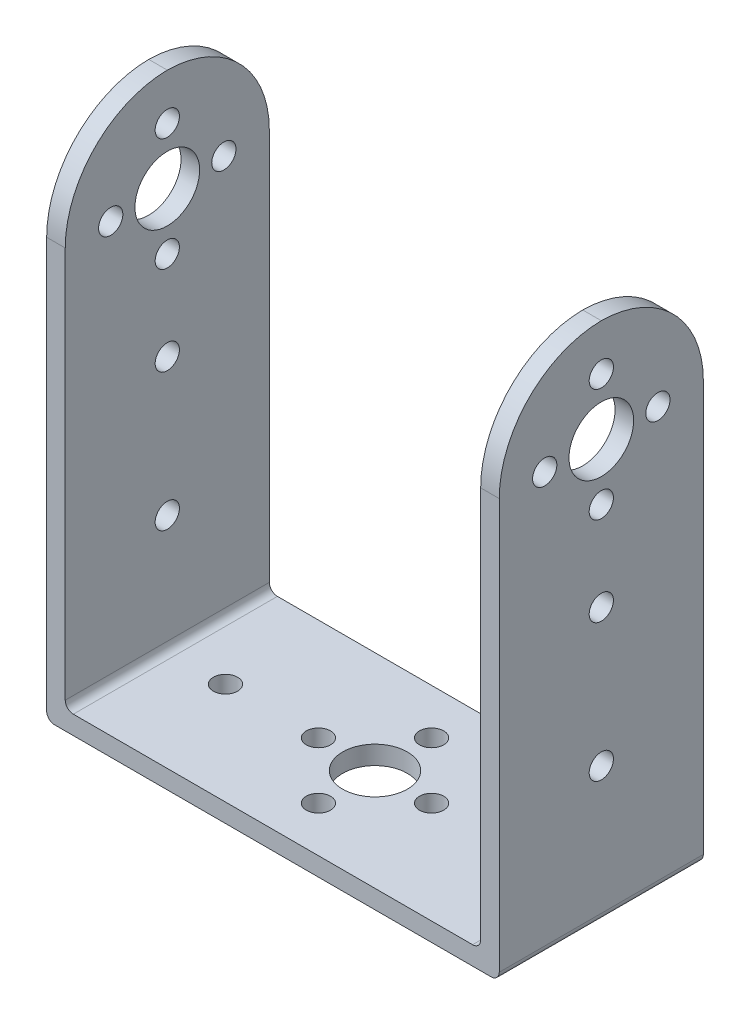
ISO-10303-21;
HEADER;
FILE_DESCRIPTION(('STEP AP214'),'2;1');
FILE_NAME('part.step','',(''),(''),'','','');
FILE_SCHEMA(('AUTOMOTIVE_DESIGN { 1 0 10303 214 1 1 1 1 }'));
ENDSEC;
DATA;
#1=APPLICATION_CONTEXT('core data for automotive mechanical design processes');
#2=APPLICATION_PROTOCOL_DEFINITION('international standard','automotive_design',2000,#1);
#3=PRODUCT_CONTEXT('',#1,'mechanical');
#4=PRODUCT('Part','Part','',(#3));
#5=PRODUCT_RELATED_PRODUCT_CATEGORY('part','',(#4));
#6=PRODUCT_DEFINITION_FORMATION('','',#4);
#7=PRODUCT_DEFINITION_CONTEXT('part definition',#1,'design');
#8=PRODUCT_DEFINITION('design','',#6,#7);
#9=PRODUCT_DEFINITION_SHAPE('','',#8);
#10=(LENGTH_UNIT() NAMED_UNIT(*) SI_UNIT(.MILLI.,.METRE.));
#11=(NAMED_UNIT(*) PLANE_ANGLE_UNIT() SI_UNIT($,.RADIAN.));
#12=(NAMED_UNIT(*) SI_UNIT($,.STERADIAN.) SOLID_ANGLE_UNIT());
#13=UNCERTAINTY_MEASURE_WITH_UNIT(LENGTH_MEASURE(1.E-05),#10,'distance_accuracy_value','');
#14=(GEOMETRIC_REPRESENTATION_CONTEXT(3) GLOBAL_UNCERTAINTY_ASSIGNED_CONTEXT((#13)) GLOBAL_UNIT_ASSIGNED_CONTEXT((#10,
#11,#12)) REPRESENTATION_CONTEXT('',''));
#15=CARTESIAN_POINT('',(0.,0.,0.));
#16=DIRECTION('',(0.,0.,1.));
#17=DIRECTION('',(1.,0.,0.));
#18=AXIS2_PLACEMENT_3D('',#15,#16,#17);
#19=CARTESIAN_POINT('',(28.,32.25,25.25));
#20=DIRECTION('',(-1.,0.,0.));
#21=DIRECTION('',(0.,-1.,0.));
#22=AXIS2_PLACEMENT_3D('',#19,#20,#21);
#23=PLANE('',#22);
#24=CARTESIAN_POINT('',(28.,1.54938724017748,12.625));
#25=DIRECTION('',(-1.,0.,0.));
#26=DIRECTION('',(0.,-1.,0.));
#27=AXIS2_PLACEMENT_3D('',#24,#25,#26);
#28=CIRCLE('',#27,1.5);
#29=CARTESIAN_POINT('',(28.,0.0493872401774768,12.625));
#30=VERTEX_POINT('',#29);
#31=EDGE_CURVE('E762',#30,#30,#28,.T.);
#32=ORIENTED_EDGE('',*,*,#31,.T.);
#33=EDGE_LOOP('',(#32));
#34=FACE_BOUND('',#33,.T.);
#35=CARTESIAN_POINT('',(28.,-15.4506127598225,12.625));
#36=DIRECTION('',(-1.,0.,0.));
#37=DIRECTION('',(0.,-1.,0.));
#38=AXIS2_PLACEMENT_3D('',#35,#36,#37);
#39=CIRCLE('',#38,1.5);
#40=CARTESIAN_POINT('',(28.,-16.9506127598225,12.625));
#41=VERTEX_POINT('',#40);
#42=EDGE_CURVE('E782',#41,#41,#39,.T.);
#43=ORIENTED_EDGE('',*,*,#42,.T.);
#44=EDGE_LOOP('',(#43));
#45=FACE_BOUND('',#44,.T.);
#46=CARTESIAN_POINT('',(28.,26.5493872401775,12.625));
#47=DIRECTION('',(-1.,0.,0.));
#48=DIRECTION('',(0.,-1.,0.));
#49=AXIS2_PLACEMENT_3D('',#46,#47,#48);
#50=CIRCLE('',#49,1.5);
#51=CARTESIAN_POINT('',(28.,25.0493872401775,12.625));
#52=VERTEX_POINT('',#51);
#53=EDGE_CURVE('E793',#52,#52,#50,.T.);
#54=ORIENTED_EDGE('',*,*,#53,.T.);
#55=EDGE_LOOP('',(#54));
#56=FACE_BOUND('',#55,.T.);
#57=CARTESIAN_POINT('',(28.,19.5493872401775,19.625));
#58=DIRECTION('',(-1.,0.,0.));
#59=DIRECTION('',(0.,-1.,0.));
#60=AXIS2_PLACEMENT_3D('',#57,#58,#59);
#61=CIRCLE('',#60,1.5);
#62=CARTESIAN_POINT('',(28.,18.0493872401775,19.625));
#63=VERTEX_POINT('',#62);
#64=EDGE_CURVE('E801',#63,#63,#61,.T.);
#65=ORIENTED_EDGE('',*,*,#64,.T.);
#66=EDGE_LOOP('',(#65));
#67=FACE_BOUND('',#66,.T.);
#68=CARTESIAN_POINT('',(28.,12.5493872401775,12.625));
#69=DIRECTION('',(-1.,0.,0.));
#70=DIRECTION('',(0.,-1.,0.));
#71=AXIS2_PLACEMENT_3D('',#68,#69,#70);
#72=CIRCLE('',#71,1.5);
#73=CARTESIAN_POINT('',(28.,11.0493872401775,12.625));
#74=VERTEX_POINT('',#73);
#75=EDGE_CURVE('E544',#74,#74,#72,.T.);
#76=ORIENTED_EDGE('',*,*,#75,.T.);
#77=EDGE_LOOP('',(#76));
#78=FACE_BOUND('',#77,.T.);
#79=CARTESIAN_POINT('',(28.,19.5493872401775,5.625));
#80=DIRECTION('',(-1.,0.,0.));
#81=DIRECTION('',(0.,-1.,0.));
#82=AXIS2_PLACEMENT_3D('',#79,#80,#81);
#83=CIRCLE('',#82,1.5);
#84=CARTESIAN_POINT('',(28.,18.0493872401775,5.625));
#85=VERTEX_POINT('',#84);
#86=EDGE_CURVE('E848',#85,#85,#83,.T.);
#87=ORIENTED_EDGE('',*,*,#86,.T.);
#88=EDGE_LOOP('',(#87));
#89=FACE_BOUND('',#88,.T.);
#90=CARTESIAN_POINT('',(28.,19.5493872401775,12.625));
#91=DIRECTION('',(-1.,0.,0.));
#92=DIRECTION('',(0.,-1.,0.));
#93=AXIS2_PLACEMENT_3D('',#90,#91,#92);
#94=CIRCLE('',#93,4.);
#95=CARTESIAN_POINT('',(28.,15.5493872401775,12.625));
#96=VERTEX_POINT('',#95);
#97=EDGE_CURVE('E318',#96,#96,#94,.T.);
#98=ORIENTED_EDGE('',*,*,#97,.T.);
#99=EDGE_LOOP('',(#98));
#100=FACE_BOUND('',#99,.T.);
#101=CARTESIAN_POINT('',(28.,19.5,12.75));
#102=DIRECTION('',(-1.,0.,0.));
#103=DIRECTION('',(0.,-1.,0.));
#104=AXIS2_PLACEMENT_3D('',#101,#102,#103);
#105=CIRCLE('',#104,12.75);
#106=CARTESIAN_POINT('',(28.,19.5,0.));
#107=VERTEX_POINT('',#106);
#108=CARTESIAN_POINT('',(28.,32.2493872401775,12.625));
#109=VERTEX_POINT('',#108);
#110=EDGE_CURVE('E74',#107,#109,#105,.F.);
#111=ORIENTED_EDGE('',*,*,#110,.T.);
#112=CARTESIAN_POINT('',(28.,19.5,12.5));
#113=DIRECTION('',(-1.,0.,0.));
#114=DIRECTION('',(0.,-1.,0.));
#115=AXIS2_PLACEMENT_3D('',#112,#113,#114);
#116=CIRCLE('',#115,12.75);
#117=CARTESIAN_POINT('',(28.,19.5,25.25));
#118=VERTEX_POINT('',#117);
#119=EDGE_CURVE('E270',#109,#118,#116,.F.);
#120=ORIENTED_EDGE('',*,*,#119,.T.);
#121=DIRECTION('',(0.,1.,0.));
#122=VECTOR('',#121,1.);
#123=CARTESIAN_POINT('',(28.,32.25,25.25));
#124=LINE('',#123,#122);
#125=CARTESIAN_POINT('',(28.,-31.25,25.25));
#126=VERTEX_POINT('',#125);
#127=EDGE_CURVE('E186',#126,#118,#124,.T.);
#128=ORIENTED_EDGE('',*,*,#127,.F.);
#129=DIRECTION('',(0.,0.,-1.));
#130=VECTOR('',#129,1.);
#131=CARTESIAN_POINT('',(28.,-31.25,25.25));
#132=LINE('',#131,#130);
#133=CARTESIAN_POINT('',(28.,-31.25,0.));
#134=VERTEX_POINT('',#133);
#135=EDGE_CURVE('E210',#126,#134,#132,.T.);
#136=ORIENTED_EDGE('',*,*,#135,.T.);
#137=DIRECTION('',(0.,1.,0.));
#138=VECTOR('',#137,1.);
#139=CARTESIAN_POINT('',(28.,32.25,0.));
#140=LINE('',#139,#138);
#141=EDGE_CURVE('E194',#134,#107,#140,.T.);
#142=ORIENTED_EDGE('',*,*,#141,.T.);
#143=EDGE_LOOP('',(#111,#120,#128,#136,#142));
#144=FACE_BOUND('',#143,.T.);
#145=ADVANCED_FACE('F56',(#34,#45,#56,#67,#78,#89,#100,#144),#23,.F.);
#146=CARTESIAN_POINT('',(-28.,32.25,25.25));
#147=DIRECTION('',(1.,0.,0.));
#148=DIRECTION('',(0.,1.,0.));
#149=AXIS2_PLACEMENT_3D('',#146,#147,#148);
#150=PLANE('',#149);
#151=CARTESIAN_POINT('',(-28.,1.54938724017747,12.625));
#152=DIRECTION('',(-1.,0.,0.));
#153=DIRECTION('',(0.,-1.,0.));
#154=AXIS2_PLACEMENT_3D('',#151,#152,#153);
#155=CIRCLE('',#154,1.5);
#156=CARTESIAN_POINT('',(-28.,0.0493872401774707,12.625));
#157=VERTEX_POINT('',#156);
#158=EDGE_CURVE('E773',#157,#157,#155,.T.);
#159=ORIENTED_EDGE('',*,*,#158,.F.);
#160=EDGE_LOOP('',(#159));
#161=FACE_BOUND('',#160,.T.);
#162=CARTESIAN_POINT('',(-28.,-15.4506127598225,12.625));
#163=DIRECTION('',(-1.,0.,0.));
#164=DIRECTION('',(0.,-1.,0.));
#165=AXIS2_PLACEMENT_3D('',#162,#163,#164);
#166=CIRCLE('',#165,1.5);
#167=CARTESIAN_POINT('',(-28.,-16.9506127598225,12.625));
#168=VERTEX_POINT('',#167);
#169=EDGE_CURVE('E774',#168,#168,#166,.T.);
#170=ORIENTED_EDGE('',*,*,#169,.F.);
#171=EDGE_LOOP('',(#170));
#172=FACE_BOUND('',#171,.T.);
#173=CARTESIAN_POINT('',(-28.,26.5493872401775,12.625));
#174=DIRECTION('',(-1.,0.,0.));
#175=DIRECTION('',(0.,-1.,0.));
#176=AXIS2_PLACEMENT_3D('',#173,#174,#175);
#177=CIRCLE('',#176,1.5);
#178=CARTESIAN_POINT('',(-28.,25.0493872401775,12.625));
#179=VERTEX_POINT('',#178);
#180=EDGE_CURVE('E789',#179,#179,#177,.T.);
#181=ORIENTED_EDGE('',*,*,#180,.F.);
#182=EDGE_LOOP('',(#181));
#183=FACE_BOUND('',#182,.T.);
#184=CARTESIAN_POINT('',(-28.,19.5493872401775,19.625));
#185=DIRECTION('',(-1.,0.,0.));
#186=DIRECTION('',(0.,-1.,0.));
#187=AXIS2_PLACEMENT_3D('',#184,#185,#186);
#188=CIRCLE('',#187,1.5);
#189=CARTESIAN_POINT('',(-28.,18.0493872401775,19.625));
#190=VERTEX_POINT('',#189);
#191=EDGE_CURVE('E797',#190,#190,#188,.T.);
#192=ORIENTED_EDGE('',*,*,#191,.F.);
#193=EDGE_LOOP('',(#192));
#194=FACE_BOUND('',#193,.T.);
#195=CARTESIAN_POINT('',(-28.,12.5493872401775,12.625));
#196=DIRECTION('',(-1.,0.,0.));
#197=DIRECTION('',(0.,-1.,0.));
#198=AXIS2_PLACEMENT_3D('',#195,#196,#197);
#199=CIRCLE('',#198,1.5);
#200=CARTESIAN_POINT('',(-28.,11.0493872401775,12.625));
#201=VERTEX_POINT('',#200);
#202=EDGE_CURVE('E805',#201,#201,#199,.T.);
#203=ORIENTED_EDGE('',*,*,#202,.F.);
#204=EDGE_LOOP('',(#203));
#205=FACE_BOUND('',#204,.T.);
#206=CARTESIAN_POINT('',(-28.,19.5493872401775,5.625));
#207=DIRECTION('',(-1.,0.,0.));
#208=DIRECTION('',(0.,-1.,0.));
#209=AXIS2_PLACEMENT_3D('',#206,#207,#208);
#210=CIRCLE('',#209,1.5);
#211=CARTESIAN_POINT('',(-28.,18.0493872401775,5.625));
#212=VERTEX_POINT('',#211);
#213=EDGE_CURVE('E843',#212,#212,#210,.T.);
#214=ORIENTED_EDGE('',*,*,#213,.F.);
#215=EDGE_LOOP('',(#214));
#216=FACE_BOUND('',#215,.T.);
#217=CARTESIAN_POINT('',(-28.,19.5493872401775,12.625));
#218=DIRECTION('',(-1.,0.,0.));
#219=DIRECTION('',(0.,-1.,0.));
#220=AXIS2_PLACEMENT_3D('',#217,#218,#219);
#221=CIRCLE('',#220,4.);
#222=CARTESIAN_POINT('',(-28.,15.5493872401775,12.625));
#223=VERTEX_POINT('',#222);
#224=EDGE_CURVE('E779',#223,#223,#221,.T.);
#225=ORIENTED_EDGE('',*,*,#224,.F.);
#226=EDGE_LOOP('',(#225));
#227=FACE_BOUND('',#226,.T.);
#228=DIRECTION('',(0.,-1.,0.));
#229=VECTOR('',#228,1.);
#230=CARTESIAN_POINT('',(-28.,32.25,25.25));
#231=LINE('',#230,#229);
#232=CARTESIAN_POINT('',(-28.,19.5,25.25));
#233=VERTEX_POINT('',#232);
#234=CARTESIAN_POINT('',(-28.,-31.25,25.25));
#235=VERTEX_POINT('',#234);
#236=EDGE_CURVE('E192',#233,#235,#231,.T.);
#237=ORIENTED_EDGE('',*,*,#236,.F.);
#238=CARTESIAN_POINT('',(-28.,19.5,12.5));
#239=DIRECTION('',(1.,0.,0.));
#240=DIRECTION('',(0.,1.,0.));
#241=AXIS2_PLACEMENT_3D('',#238,#239,#240);
#242=CIRCLE('',#241,12.75);
#243=CARTESIAN_POINT('',(-28.,32.2493872401775,12.625));
#244=VERTEX_POINT('',#243);
#245=EDGE_CURVE('E253',#233,#244,#242,.F.);
#246=ORIENTED_EDGE('',*,*,#245,.T.);
#247=CARTESIAN_POINT('',(-28.,19.5,12.75));
#248=DIRECTION('',(1.,0.,0.));
#249=DIRECTION('',(0.,1.,0.));
#250=AXIS2_PLACEMENT_3D('',#247,#248,#249);
#251=CIRCLE('',#250,12.75);
#252=CARTESIAN_POINT('',(-28.,19.5,0.));
#253=VERTEX_POINT('',#252);
#254=EDGE_CURVE('E250',#244,#253,#251,.F.);
#255=ORIENTED_EDGE('',*,*,#254,.T.);
#256=DIRECTION('',(0.,-1.,0.));
#257=VECTOR('',#256,1.);
#258=CARTESIAN_POINT('',(-28.,32.25,0.));
#259=LINE('',#258,#257);
#260=CARTESIAN_POINT('',(-28.,-31.25,0.));
#261=VERTEX_POINT('',#260);
#262=EDGE_CURVE('E187',#253,#261,#259,.T.);
#263=ORIENTED_EDGE('',*,*,#262,.T.);
#264=DIRECTION('',(0.,0.,-1.));
#265=VECTOR('',#264,1.);
#266=CARTESIAN_POINT('',(-28.,-31.25,25.25));
#267=LINE('',#266,#265);
#268=EDGE_CURVE('E167',#261,#235,#267,.F.);
#269=ORIENTED_EDGE('',*,*,#268,.T.);
#270=EDGE_LOOP('',(#237,#246,#255,#263,#269));
#271=FACE_BOUND('',#270,.T.);
#272=ADVANCED_FACE('F438',(#161,#172,#183,#194,#205,#216,#227,#271),#150,.F.);
#273=CARTESIAN_POINT('',(-28.,-32.25,25.25));
#274=DIRECTION('',(0.,1.,0.));
#275=DIRECTION('',(0.,0.,1.));
#276=AXIS2_PLACEMENT_3D('',#273,#274,#275);
#277=PLANE('',#276);
#278=CARTESIAN_POINT('',(0.,-32.25,19.625));
#279=DIRECTION('',(0.,-1.,0.));
#280=DIRECTION('',(0.,0.,-1.));
#281=AXIS2_PLACEMENT_3D('',#278,#279,#280);
#282=CIRCLE('',#281,1.5);
#283=CARTESIAN_POINT('',(0.,-32.25,18.125));
#284=VERTEX_POINT('',#283);
#285=EDGE_CURVE('E364',#284,#284,#282,.T.);
#286=ORIENTED_EDGE('',*,*,#285,.F.);
#287=EDGE_LOOP('',(#286));
#288=FACE_BOUND('',#287,.T.);
#289=CARTESIAN_POINT('',(0.,-32.25,5.625));
#290=DIRECTION('',(0.,-1.,0.));
#291=DIRECTION('',(0.,0.,-1.));
#292=AXIS2_PLACEMENT_3D('',#289,#290,#291);
#293=CIRCLE('',#292,1.5);
#294=CARTESIAN_POINT('',(0.,-32.25,4.125));
#295=VERTEX_POINT('',#294);
#296=EDGE_CURVE('E368',#295,#295,#293,.T.);
#297=ORIENTED_EDGE('',*,*,#296,.F.);
#298=EDGE_LOOP('',(#297));
#299=FACE_BOUND('',#298,.T.);
#300=CARTESIAN_POINT('',(-7.,-32.25,12.625));
#301=DIRECTION('',(0.,-1.,0.));
#302=DIRECTION('',(0.,0.,-1.));
#303=AXIS2_PLACEMENT_3D('',#300,#301,#302);
#304=CIRCLE('',#303,1.5);
#305=CARTESIAN_POINT('',(-7.,-32.25,11.125));
#306=VERTEX_POINT('',#305);
#307=EDGE_CURVE('E372',#306,#306,#304,.T.);
#308=ORIENTED_EDGE('',*,*,#307,.F.);
#309=EDGE_LOOP('',(#308));
#310=FACE_BOUND('',#309,.T.);
#311=CARTESIAN_POINT('',(7.,-32.25,12.625));
#312=DIRECTION('',(0.,-1.,0.));
#313=DIRECTION('',(0.,0.,-1.));
#314=AXIS2_PLACEMENT_3D('',#311,#312,#313);
#315=CIRCLE('',#314,1.5);
#316=CARTESIAN_POINT('',(7.,-32.25,11.125));
#317=VERTEX_POINT('',#316);
#318=EDGE_CURVE('E376',#317,#317,#315,.T.);
#319=ORIENTED_EDGE('',*,*,#318,.F.);
#320=EDGE_LOOP('',(#319));
#321=FACE_BOUND('',#320,.T.);
#322=CARTESIAN_POINT('',(18.5,-32.25,12.625));
#323=DIRECTION('',(0.,-1.,0.));
#324=DIRECTION('',(0.,0.,-1.));
#325=AXIS2_PLACEMENT_3D('',#322,#323,#324);
#326=CIRCLE('',#325,1.5);
#327=CARTESIAN_POINT('',(18.5,-32.25,11.125));
#328=VERTEX_POINT('',#327);
#329=EDGE_CURVE('E360',#328,#328,#326,.T.);
#330=ORIENTED_EDGE('',*,*,#329,.F.);
#331=EDGE_LOOP('',(#330));
#332=FACE_BOUND('',#331,.T.);
#333=CARTESIAN_POINT('',(-18.5,-32.25,12.625));
#334=DIRECTION('',(0.,-1.,0.));
#335=DIRECTION('',(0.,0.,-1.));
#336=AXIS2_PLACEMENT_3D('',#333,#334,#335);
#337=CIRCLE('',#336,1.5);
#338=CARTESIAN_POINT('',(-18.5,-32.25,11.125));
#339=VERTEX_POINT('',#338);
#340=EDGE_CURVE('E359',#339,#339,#337,.T.);
#341=ORIENTED_EDGE('',*,*,#340,.F.);
#342=EDGE_LOOP('',(#341));
#343=FACE_BOUND('',#342,.T.);
#344=CARTESIAN_POINT('',(0.,-32.25,12.625));
#345=DIRECTION('',(0.,-1.,0.));
#346=DIRECTION('',(0.,0.,-1.));
#347=AXIS2_PLACEMENT_3D('',#344,#345,#346);
#348=CIRCLE('',#347,4.);
#349=CARTESIAN_POINT('',(0.,-32.25,8.625));
#350=VERTEX_POINT('',#349);
#351=EDGE_CURVE('E290',#350,#350,#348,.T.);
#352=ORIENTED_EDGE('',*,*,#351,.F.);
#353=EDGE_LOOP('',(#352));
#354=FACE_BOUND('',#353,.T.);
#355=DIRECTION('',(1.,0.,0.));
#356=VECTOR('',#355,1.);
#357=CARTESIAN_POINT('',(-28.,-32.25,25.25));
#358=LINE('',#357,#356);
#359=CARTESIAN_POINT('',(-27.,-32.25,25.25));
#360=VERTEX_POINT('',#359);
#361=CARTESIAN_POINT('',(27.,-32.25,25.25));
#362=VERTEX_POINT('',#361);
#363=EDGE_CURVE('E180',#360,#362,#358,.T.);
#364=ORIENTED_EDGE('',*,*,#363,.F.);
#365=DIRECTION('',(0.,0.,-1.));
#366=VECTOR('',#365,1.);
#367=CARTESIAN_POINT('',(-27.,-32.25,25.25));
#368=LINE('',#367,#366);
#369=CARTESIAN_POINT('',(-27.,-32.25,0.));
#370=VERTEX_POINT('',#369);
#371=EDGE_CURVE('E165',#360,#370,#368,.T.);
#372=ORIENTED_EDGE('',*,*,#371,.T.);
#373=DIRECTION('',(1.,0.,0.));
#374=VECTOR('',#373,1.);
#375=CARTESIAN_POINT('',(-28.,-32.25,0.));
#376=LINE('',#375,#374);
#377=CARTESIAN_POINT('',(27.,-32.25,0.));
#378=VERTEX_POINT('',#377);
#379=EDGE_CURVE('E177',#370,#378,#376,.T.);
#380=ORIENTED_EDGE('',*,*,#379,.T.);
#381=DIRECTION('',(0.,0.,-1.));
#382=VECTOR('',#381,1.);
#383=CARTESIAN_POINT('',(27.,-32.25,25.25));
#384=LINE('',#383,#382);
#385=EDGE_CURVE('E182',#378,#362,#384,.F.);
#386=ORIENTED_EDGE('',*,*,#385,.T.);
#387=EDGE_LOOP('',(#364,#372,#380,#386));
#388=FACE_BOUND('',#387,.T.);
#389=ADVANCED_FACE('F176',(#288,#299,#310,#321,#332,#343,#354,#388),#277,.F.);
#390=CARTESIAN_POINT('',(0.,0.,25.25));
#391=DIRECTION('',(0.,0.,1.));
#392=DIRECTION('',(1.,0.,0.));
#393=AXIS2_PLACEMENT_3D('',#390,#391,#392);
#394=PLANE('',#393);
#395=DIRECTION('',(0.,-1.,0.));
#396=VECTOR('',#395,1.);
#397=CARTESIAN_POINT('',(-25.7,32.25,25.25));
#398=LINE('',#397,#396);
#399=CARTESIAN_POINT('',(-25.7,19.5,25.25));
#400=VERTEX_POINT('',#399);
#401=CARTESIAN_POINT('',(-25.7,-28.95,25.25));
#402=VERTEX_POINT('',#401);
#403=EDGE_CURVE('E279',#400,#402,#398,.T.);
#404=ORIENTED_EDGE('',*,*,#403,.F.);
#405=DIRECTION('',(-1.,0.,0.));
#406=VECTOR('',#405,1.);
#407=CARTESIAN_POINT('',(-28.,19.5,25.25));
#408=LINE('',#407,#406);
#409=EDGE_CURVE('E246',#400,#233,#408,.T.);
#410=ORIENTED_EDGE('',*,*,#409,.T.);
#411=ORIENTED_EDGE('',*,*,#236,.T.);
#412=CARTESIAN_POINT('',(-27.,-31.25,25.25));
#413=DIRECTION('',(0.,0.,1.));
#414=DIRECTION('',(1.,0.,0.));
#415=AXIS2_PLACEMENT_3D('',#412,#413,#414);
#416=CIRCLE('',#415,1.);
#417=EDGE_CURVE('E207',#235,#360,#416,.T.);
#418=ORIENTED_EDGE('',*,*,#417,.T.);
#419=ORIENTED_EDGE('',*,*,#363,.T.);
#420=CARTESIAN_POINT('',(27.,-31.25,25.25));
#421=DIRECTION('',(0.,0.,1.));
#422=DIRECTION('',(1.,0.,0.));
#423=AXIS2_PLACEMENT_3D('',#420,#421,#422);
#424=CIRCLE('',#423,1.);
#425=EDGE_CURVE('E204',#362,#126,#424,.T.);
#426=ORIENTED_EDGE('',*,*,#425,.T.);
#427=ORIENTED_EDGE('',*,*,#127,.T.);
#428=DIRECTION('',(-1.,0.,0.));
#429=VECTOR('',#428,1.);
#430=CARTESIAN_POINT('',(25.7,19.5,25.25));
#431=LINE('',#430,#429);
#432=CARTESIAN_POINT('',(25.7,19.5,25.25));
#433=VERTEX_POINT('',#432);
#434=EDGE_CURVE('E242',#118,#433,#431,.T.);
#435=ORIENTED_EDGE('',*,*,#434,.T.);
#436=DIRECTION('',(0.,1.,0.));
#437=VECTOR('',#436,1.);
#438=CARTESIAN_POINT('',(25.7,32.25,25.25));
#439=LINE('',#438,#437);
#440=CARTESIAN_POINT('',(25.7,-28.95,25.25));
#441=VERTEX_POINT('',#440);
#442=EDGE_CURVE('E390',#441,#433,#439,.T.);
#443=ORIENTED_EDGE('',*,*,#442,.F.);
#444=CARTESIAN_POINT('',(24.7,-28.95,25.25));
#445=DIRECTION('',(0.,0.,1.));
#446=DIRECTION('',(1.,0.,0.));
#447=AXIS2_PLACEMENT_3D('',#444,#445,#446);
#448=CIRCLE('',#447,1.);
#449=CARTESIAN_POINT('',(24.7,-29.95,25.25));
#450=VERTEX_POINT('',#449);
#451=EDGE_CURVE('E229',#441,#450,#448,.F.);
#452=ORIENTED_EDGE('',*,*,#451,.T.);
#453=DIRECTION('',(1.,0.,0.));
#454=VECTOR('',#453,1.);
#455=CARTESIAN_POINT('',(-25.7,-29.95,25.25));
#456=LINE('',#455,#454);
#457=CARTESIAN_POINT('',(-24.7,-29.95,25.25));
#458=VERTEX_POINT('',#457);
#459=EDGE_CURVE('E399',#458,#450,#456,.T.);
#460=ORIENTED_EDGE('',*,*,#459,.F.);
#461=CARTESIAN_POINT('',(-24.7,-28.95,25.25));
#462=DIRECTION('',(0.,0.,1.));
#463=DIRECTION('',(1.,0.,0.));
#464=AXIS2_PLACEMENT_3D('',#461,#462,#463);
#465=CIRCLE('',#464,1.);
#466=EDGE_CURVE('E235',#458,#402,#465,.F.);
#467=ORIENTED_EDGE('',*,*,#466,.T.);
#468=EDGE_LOOP('',(#404,#410,#411,#418,#419,#426,#427,#435,#443,#452,#460,#467));
#469=FACE_BOUND('',#468,.T.);
#470=ADVANCED_FACE('F420',(#469),#394,.T.);
#471=CARTESIAN_POINT('',(0.,0.,0.));
#472=DIRECTION('',(0.,0.,1.));
#473=DIRECTION('',(1.,0.,0.));
#474=AXIS2_PLACEMENT_3D('',#471,#472,#473);
#475=PLANE('',#474);
#476=ORIENTED_EDGE('',*,*,#262,.F.);
#477=DIRECTION('',(-1.,0.,0.));
#478=VECTOR('',#477,1.);
#479=CARTESIAN_POINT('',(0.,19.5,0.));
#480=LINE('',#479,#478);
#481=CARTESIAN_POINT('',(-25.7,19.5,0.));
#482=VERTEX_POINT('',#481);
#483=EDGE_CURVE('E13',#253,#482,#480,.F.);
#484=ORIENTED_EDGE('',*,*,#483,.T.);
#485=DIRECTION('',(0.,-1.,0.));
#486=VECTOR('',#485,1.);
#487=CARTESIAN_POINT('',(-25.7,32.25,0.));
#488=LINE('',#487,#486);
#489=CARTESIAN_POINT('',(-25.7,-28.95,0.));
#490=VERTEX_POINT('',#489);
#491=EDGE_CURVE('E386',#482,#490,#488,.T.);
#492=ORIENTED_EDGE('',*,*,#491,.T.);
#493=CARTESIAN_POINT('',(-24.7,-28.95,0.));
#494=DIRECTION('',(0.,0.,1.));
#495=DIRECTION('',(1.,0.,0.));
#496=AXIS2_PLACEMENT_3D('',#493,#494,#495);
#497=CIRCLE('',#496,1.);
#498=CARTESIAN_POINT('',(-24.7,-29.95,0.));
#499=VERTEX_POINT('',#498);
#500=EDGE_CURVE('E239',#490,#499,#497,.T.);
#501=ORIENTED_EDGE('',*,*,#500,.T.);
#502=DIRECTION('',(1.,0.,0.));
#503=VECTOR('',#502,1.);
#504=CARTESIAN_POINT('',(-25.7,-29.95,0.));
#505=LINE('',#504,#503);
#506=CARTESIAN_POINT('',(24.7,-29.95,0.));
#507=VERTEX_POINT('',#506);
#508=EDGE_CURVE('E389',#499,#507,#505,.T.);
#509=ORIENTED_EDGE('',*,*,#508,.T.);
#510=CARTESIAN_POINT('',(24.7,-28.95,0.));
#511=DIRECTION('',(0.,0.,1.));
#512=DIRECTION('',(1.,0.,0.));
#513=AXIS2_PLACEMENT_3D('',#510,#511,#512);
#514=CIRCLE('',#513,1.);
#515=CARTESIAN_POINT('',(25.7,-28.95,0.));
#516=VERTEX_POINT('',#515);
#517=EDGE_CURVE('E232',#507,#516,#514,.T.);
#518=ORIENTED_EDGE('',*,*,#517,.T.);
#519=DIRECTION('',(0.,1.,0.));
#520=VECTOR('',#519,1.);
#521=CARTESIAN_POINT('',(25.7,32.25,0.));
#522=LINE('',#521,#520);
#523=CARTESIAN_POINT('',(25.7,19.5,0.));
#524=VERTEX_POINT('',#523);
#525=EDGE_CURVE('E394',#516,#524,#522,.T.);
#526=ORIENTED_EDGE('',*,*,#525,.T.);
#527=DIRECTION('',(-1.,0.,0.));
#528=VECTOR('',#527,1.);
#529=CARTESIAN_POINT('',(0.,19.5,0.));
#530=LINE('',#529,#528);
#531=EDGE_CURVE('E66',#524,#107,#530,.F.);
#532=ORIENTED_EDGE('',*,*,#531,.T.);
#533=ORIENTED_EDGE('',*,*,#141,.F.);
#534=CARTESIAN_POINT('',(27.,-31.25,0.));
#535=DIRECTION('',(0.,0.,1.));
#536=DIRECTION('',(1.,0.,0.));
#537=AXIS2_PLACEMENT_3D('',#534,#535,#536);
#538=CIRCLE('',#537,1.);
#539=EDGE_CURVE('E171',#134,#378,#538,.F.);
#540=ORIENTED_EDGE('',*,*,#539,.T.);
#541=ORIENTED_EDGE('',*,*,#379,.F.);
#542=CARTESIAN_POINT('',(-27.,-31.25,0.));
#543=DIRECTION('',(0.,0.,1.));
#544=DIRECTION('',(1.,0.,0.));
#545=AXIS2_PLACEMENT_3D('',#542,#543,#544);
#546=CIRCLE('',#545,1.);
#547=EDGE_CURVE('E161',#370,#261,#546,.F.);
#548=ORIENTED_EDGE('',*,*,#547,.T.);
#549=EDGE_LOOP('',(#476,#484,#492,#501,#509,#518,#526,#532,#533,#540,#541,#548));
#550=FACE_BOUND('',#549,.T.);
#551=ADVANCED_FACE('F184',(#550),#475,.F.);
#552=CARTESIAN_POINT('',(-25.7,32.25,0.));
#553=DIRECTION('',(-1.,0.,0.));
#554=DIRECTION('',(0.,-1.,0.));
#555=AXIS2_PLACEMENT_3D('',#552,#553,#554);
#556=PLANE('',#555);
#557=CARTESIAN_POINT('',(-25.7,1.54938724017747,12.625));
#558=DIRECTION('',(-1.,0.,0.));
#559=DIRECTION('',(0.,-1.,0.));
#560=AXIS2_PLACEMENT_3D('',#557,#558,#559);
#561=CIRCLE('',#560,1.5);
#562=CARTESIAN_POINT('',(-25.7,0.0493872401774709,12.625));
#563=VERTEX_POINT('',#562);
#564=EDGE_CURVE('E355',#563,#563,#561,.T.);
#565=ORIENTED_EDGE('',*,*,#564,.T.);
#566=EDGE_LOOP('',(#565));
#567=FACE_BOUND('',#566,.T.);
#568=CARTESIAN_POINT('',(-25.7,-15.4506127598225,12.625));
#569=DIRECTION('',(-1.,0.,0.));
#570=DIRECTION('',(0.,-1.,0.));
#571=AXIS2_PLACEMENT_3D('',#568,#569,#570);
#572=CIRCLE('',#571,1.5);
#573=CARTESIAN_POINT('',(-25.7,-16.9506127598225,12.625));
#574=VERTEX_POINT('',#573);
#575=EDGE_CURVE('E341',#574,#574,#572,.T.);
#576=ORIENTED_EDGE('',*,*,#575,.T.);
#577=EDGE_LOOP('',(#576));
#578=FACE_BOUND('',#577,.T.);
#579=CARTESIAN_POINT('',(-25.7,26.5493872401775,12.625));
#580=DIRECTION('',(-1.,0.,0.));
#581=DIRECTION('',(0.,-1.,0.));
#582=AXIS2_PLACEMENT_3D('',#579,#580,#581);
#583=CIRCLE('',#582,1.5);
#584=CARTESIAN_POINT('',(-25.7,25.0493872401775,12.625));
#585=VERTEX_POINT('',#584);
#586=EDGE_CURVE('E337',#585,#585,#583,.T.);
#587=ORIENTED_EDGE('',*,*,#586,.T.);
#588=EDGE_LOOP('',(#587));
#589=FACE_BOUND('',#588,.T.);
#590=CARTESIAN_POINT('',(-25.7,19.5493872401775,19.625));
#591=DIRECTION('',(-1.,0.,0.));
#592=DIRECTION('',(0.,-1.,0.));
#593=AXIS2_PLACEMENT_3D('',#590,#591,#592);
#594=CIRCLE('',#593,1.5);
#595=CARTESIAN_POINT('',(-25.7,18.0493872401775,19.625));
#596=VERTEX_POINT('',#595);
#597=EDGE_CURVE('E333',#596,#596,#594,.T.);
#598=ORIENTED_EDGE('',*,*,#597,.T.);
#599=EDGE_LOOP('',(#598));
#600=FACE_BOUND('',#599,.T.);
#601=CARTESIAN_POINT('',(-25.7,12.5493872401775,12.625));
#602=DIRECTION('',(-1.,0.,0.));
#603=DIRECTION('',(0.,-1.,0.));
#604=AXIS2_PLACEMENT_3D('',#601,#602,#603);
#605=CIRCLE('',#604,1.5);
#606=CARTESIAN_POINT('',(-25.7,11.0493872401775,12.625));
#607=VERTEX_POINT('',#606);
#608=EDGE_CURVE('E328',#607,#607,#605,.T.);
#609=ORIENTED_EDGE('',*,*,#608,.T.);
#610=EDGE_LOOP('',(#609));
#611=FACE_BOUND('',#610,.T.);
#612=CARTESIAN_POINT('',(-25.7,19.5493872401775,5.625));
#613=DIRECTION('',(-1.,0.,0.));
#614=DIRECTION('',(0.,-1.,0.));
#615=AXIS2_PLACEMENT_3D('',#612,#613,#614);
#616=CIRCLE('',#615,1.5);
#617=CARTESIAN_POINT('',(-25.7,18.0493872401775,5.625));
#618=VERTEX_POINT('',#617);
#619=EDGE_CURVE('E323',#618,#618,#616,.T.);
#620=ORIENTED_EDGE('',*,*,#619,.T.);
#621=EDGE_LOOP('',(#620));
#622=FACE_BOUND('',#621,.T.);
#623=CARTESIAN_POINT('',(-25.7,19.5493872401775,12.625));
#624=DIRECTION('',(-1.,0.,0.));
#625=DIRECTION('',(0.,-1.,0.));
#626=AXIS2_PLACEMENT_3D('',#623,#624,#625);
#627=CIRCLE('',#626,4.);
#628=CARTESIAN_POINT('',(-25.7,15.5493872401775,12.625));
#629=VERTEX_POINT('',#628);
#630=EDGE_CURVE('E317',#629,#629,#627,.T.);
#631=ORIENTED_EDGE('',*,*,#630,.T.);
#632=EDGE_LOOP('',(#631));
#633=FACE_BOUND('',#632,.T.);
#634=CARTESIAN_POINT('',(-25.7,19.5,12.75));
#635=DIRECTION('',(-1.,0.,0.));
#636=DIRECTION('',(0.,-1.,0.));
#637=AXIS2_PLACEMENT_3D('',#634,#635,#636);
#638=CIRCLE('',#637,12.75);
#639=CARTESIAN_POINT('',(-25.7,32.2493872401775,12.625));
#640=VERTEX_POINT('',#639);
#641=EDGE_CURVE('E256',#482,#640,#638,.F.);
#642=ORIENTED_EDGE('',*,*,#641,.T.);
#643=CARTESIAN_POINT('',(-25.7,19.5,12.5));
#644=DIRECTION('',(-1.,0.,0.));
#645=DIRECTION('',(0.,-1.,0.));
#646=AXIS2_PLACEMENT_3D('',#643,#644,#645);
#647=CIRCLE('',#646,12.75);
#648=EDGE_CURVE('E259',#640,#400,#647,.F.);
#649=ORIENTED_EDGE('',*,*,#648,.T.);
#650=ORIENTED_EDGE('',*,*,#403,.T.);
#651=DIRECTION('',(0.,0.,1.));
#652=VECTOR('',#651,1.);
#653=CARTESIAN_POINT('',(-25.7,-28.95,0.));
#654=LINE('',#653,#652);
#655=EDGE_CURVE('E225',#402,#490,#654,.F.);
#656=ORIENTED_EDGE('',*,*,#655,.T.);
#657=ORIENTED_EDGE('',*,*,#491,.F.);
#658=EDGE_LOOP('',(#642,#649,#650,#656,#657));
#659=FACE_BOUND('',#658,.T.);
#660=ADVANCED_FACE('F455',(#567,#578,#589,#600,#611,#622,#633,#659),#556,.F.);
#661=CARTESIAN_POINT('',(25.7,32.25,0.));
#662=DIRECTION('',(1.,0.,0.));
#663=DIRECTION('',(0.,1.,0.));
#664=AXIS2_PLACEMENT_3D('',#661,#662,#663);
#665=PLANE('',#664);
#666=CARTESIAN_POINT('',(25.7,1.54938724017748,12.625));
#667=DIRECTION('',(1.,0.,0.));
#668=DIRECTION('',(0.,1.,0.));
#669=AXIS2_PLACEMENT_3D('',#666,#667,#668);
#670=CIRCLE('',#669,1.5);
#671=CARTESIAN_POINT('',(25.7,3.04938724017748,12.625));
#672=VERTEX_POINT('',#671);
#673=EDGE_CURVE('E60',#672,#672,#670,.T.);
#674=ORIENTED_EDGE('',*,*,#673,.T.);
#675=EDGE_LOOP('',(#674));
#676=FACE_BOUND('',#675,.T.);
#677=CARTESIAN_POINT('',(25.7,-15.4506127598225,12.625));
#678=DIRECTION('',(1.,0.,0.));
#679=DIRECTION('',(0.,1.,0.));
#680=AXIS2_PLACEMENT_3D('',#677,#678,#679);
#681=CIRCLE('',#680,1.5);
#682=CARTESIAN_POINT('',(25.7,-13.9506127598225,12.625));
#683=VERTEX_POINT('',#682);
#684=EDGE_CURVE('E338',#683,#683,#681,.T.);
#685=ORIENTED_EDGE('',*,*,#684,.T.);
#686=EDGE_LOOP('',(#685));
#687=FACE_BOUND('',#686,.T.);
#688=CARTESIAN_POINT('',(25.7,26.5493872401775,12.625));
#689=DIRECTION('',(1.,0.,0.));
#690=DIRECTION('',(0.,1.,0.));
#691=AXIS2_PLACEMENT_3D('',#688,#689,#690);
#692=CIRCLE('',#691,1.5);
#693=CARTESIAN_POINT('',(25.7,28.0493872401775,12.625));
#694=VERTEX_POINT('',#693);
#695=EDGE_CURVE('E334',#694,#694,#692,.T.);
#696=ORIENTED_EDGE('',*,*,#695,.T.);
#697=EDGE_LOOP('',(#696));
#698=FACE_BOUND('',#697,.T.);
#699=CARTESIAN_POINT('',(25.7,19.5493872401775,19.625));
#700=DIRECTION('',(1.,0.,0.));
#701=DIRECTION('',(0.,1.,0.));
#702=AXIS2_PLACEMENT_3D('',#699,#700,#701);
#703=CIRCLE('',#702,1.5);
#704=CARTESIAN_POINT('',(25.7,21.0493872401775,19.625));
#705=VERTEX_POINT('',#704);
#706=EDGE_CURVE('E329',#705,#705,#703,.T.);
#707=ORIENTED_EDGE('',*,*,#706,.T.);
#708=EDGE_LOOP('',(#707));
#709=FACE_BOUND('',#708,.T.);
#710=CARTESIAN_POINT('',(25.7,12.5493872401775,12.625));
#711=DIRECTION('',(1.,0.,0.));
#712=DIRECTION('',(0.,1.,0.));
#713=AXIS2_PLACEMENT_3D('',#710,#711,#712);
#714=CIRCLE('',#713,1.5);
#715=CARTESIAN_POINT('',(25.7,14.0493872401775,12.625));
#716=VERTEX_POINT('',#715);
#717=EDGE_CURVE('E324',#716,#716,#714,.T.);
#718=ORIENTED_EDGE('',*,*,#717,.T.);
#719=EDGE_LOOP('',(#718));
#720=FACE_BOUND('',#719,.T.);
#721=CARTESIAN_POINT('',(25.7,19.5493872401775,5.625));
#722=DIRECTION('',(1.,0.,0.));
#723=DIRECTION('',(0.,1.,0.));
#724=AXIS2_PLACEMENT_3D('',#721,#722,#723);
#725=CIRCLE('',#724,1.5);
#726=CARTESIAN_POINT('',(25.7,21.0493872401775,5.625));
#727=VERTEX_POINT('',#726);
#728=EDGE_CURVE('E319',#727,#727,#725,.T.);
#729=ORIENTED_EDGE('',*,*,#728,.T.);
#730=EDGE_LOOP('',(#729));
#731=FACE_BOUND('',#730,.T.);
#732=CARTESIAN_POINT('',(25.7,19.5493872401775,12.625));
#733=DIRECTION('',(1.,0.,0.));
#734=DIRECTION('',(0.,1.,0.));
#735=AXIS2_PLACEMENT_3D('',#732,#733,#734);
#736=CIRCLE('',#735,4.);
#737=CARTESIAN_POINT('',(25.7,23.5493872401775,12.625));
#738=VERTEX_POINT('',#737);
#739=EDGE_CURVE('E313',#738,#738,#736,.T.);
#740=ORIENTED_EDGE('',*,*,#739,.T.);
#741=EDGE_LOOP('',(#740));
#742=FACE_BOUND('',#741,.T.);
#743=ORIENTED_EDGE('',*,*,#442,.T.);
#744=CARTESIAN_POINT('',(25.7,19.5,12.5));
#745=DIRECTION('',(1.,0.,0.));
#746=DIRECTION('',(0.,1.,0.));
#747=AXIS2_PLACEMENT_3D('',#744,#745,#746);
#748=CIRCLE('',#747,12.75);
#749=CARTESIAN_POINT('',(25.7,32.2493872401775,12.625));
#750=VERTEX_POINT('',#749);
#751=EDGE_CURVE('E265',#433,#750,#748,.F.);
#752=ORIENTED_EDGE('',*,*,#751,.T.);
#753=CARTESIAN_POINT('',(25.7,19.5,12.75));
#754=DIRECTION('',(1.,0.,0.));
#755=DIRECTION('',(0.,1.,0.));
#756=AXIS2_PLACEMENT_3D('',#753,#754,#755);
#757=CIRCLE('',#756,12.75);
#758=EDGE_CURVE('E262',#750,#524,#757,.F.);
#759=ORIENTED_EDGE('',*,*,#758,.T.);
#760=ORIENTED_EDGE('',*,*,#525,.F.);
#761=DIRECTION('',(0.,0.,1.));
#762=VECTOR('',#761,1.);
#763=CARTESIAN_POINT('',(25.7,-28.95,25.25));
#764=LINE('',#763,#762);
#765=EDGE_CURVE('E214',#516,#441,#764,.T.);
#766=ORIENTED_EDGE('',*,*,#765,.T.);
#767=EDGE_LOOP('',(#743,#752,#759,#760,#766));
#768=FACE_BOUND('',#767,.T.);
#769=ADVANCED_FACE('F460',(#676,#687,#698,#709,#720,#731,#742,#768),#665,.F.);
#770=CARTESIAN_POINT('',(-25.7,-29.95,0.));
#771=DIRECTION('',(0.,-1.,0.));
#772=DIRECTION('',(0.,0.,-1.));
#773=AXIS2_PLACEMENT_3D('',#770,#771,#772);
#774=PLANE('',#773);
#775=CARTESIAN_POINT('',(0.,-29.95,19.625));
#776=DIRECTION('',(0.,-1.,0.));
#777=DIRECTION('',(0.,0.,-1.));
#778=AXIS2_PLACEMENT_3D('',#775,#776,#777);
#779=CIRCLE('',#778,1.5);
#780=CARTESIAN_POINT('',(0.,-29.95,18.125));
#781=VERTEX_POINT('',#780);
#782=EDGE_CURVE('E284',#781,#781,#779,.T.);
#783=ORIENTED_EDGE('',*,*,#782,.T.);
#784=EDGE_LOOP('',(#783));
#785=FACE_BOUND('',#784,.T.);
#786=CARTESIAN_POINT('',(0.,-29.95,5.625));
#787=DIRECTION('',(0.,-1.,0.));
#788=DIRECTION('',(0.,0.,-1.));
#789=AXIS2_PLACEMENT_3D('',#786,#787,#788);
#790=CIRCLE('',#789,1.5);
#791=CARTESIAN_POINT('',(0.,-29.95,4.125));
#792=VERTEX_POINT('',#791);
#793=EDGE_CURVE('E306',#792,#792,#790,.T.);
#794=ORIENTED_EDGE('',*,*,#793,.T.);
#795=EDGE_LOOP('',(#794));
#796=FACE_BOUND('',#795,.T.);
#797=CARTESIAN_POINT('',(-7.,-29.95,12.625));
#798=DIRECTION('',(0.,-1.,0.));
#799=DIRECTION('',(0.,0.,-1.));
#800=AXIS2_PLACEMENT_3D('',#797,#798,#799);
#801=CIRCLE('',#800,1.5);
#802=CARTESIAN_POINT('',(-7.,-29.95,11.125));
#803=VERTEX_POINT('',#802);
#804=EDGE_CURVE('E302',#803,#803,#801,.T.);
#805=ORIENTED_EDGE('',*,*,#804,.T.);
#806=EDGE_LOOP('',(#805));
#807=FACE_BOUND('',#806,.T.);
#808=CARTESIAN_POINT('',(7.,-29.95,12.625));
#809=DIRECTION('',(0.,-1.,0.));
#810=DIRECTION('',(0.,0.,-1.));
#811=AXIS2_PLACEMENT_3D('',#808,#809,#810);
#812=CIRCLE('',#811,1.5);
#813=CARTESIAN_POINT('',(7.,-29.95,11.125));
#814=VERTEX_POINT('',#813);
#815=EDGE_CURVE('E298',#814,#814,#812,.T.);
#816=ORIENTED_EDGE('',*,*,#815,.T.);
#817=EDGE_LOOP('',(#816));
#818=FACE_BOUND('',#817,.T.);
#819=CARTESIAN_POINT('',(18.5,-29.95,12.625));
#820=DIRECTION('',(0.,-1.,0.));
#821=DIRECTION('',(0.,0.,-1.));
#822=AXIS2_PLACEMENT_3D('',#819,#820,#821);
#823=CIRCLE('',#822,1.5);
#824=CARTESIAN_POINT('',(18.5,-29.95,11.125));
#825=VERTEX_POINT('',#824);
#826=EDGE_CURVE('E294',#825,#825,#823,.T.);
#827=ORIENTED_EDGE('',*,*,#826,.T.);
#828=EDGE_LOOP('',(#827));
#829=FACE_BOUND('',#828,.T.);
#830=CARTESIAN_POINT('',(-18.5,-29.95,12.625));
#831=DIRECTION('',(0.,-1.,0.));
#832=DIRECTION('',(0.,0.,-1.));
#833=AXIS2_PLACEMENT_3D('',#830,#831,#832);
#834=CIRCLE('',#833,1.5);
#835=CARTESIAN_POINT('',(-18.5,-29.95,11.125));
#836=VERTEX_POINT('',#835);
#837=EDGE_CURVE('E289',#836,#836,#834,.T.);
#838=ORIENTED_EDGE('',*,*,#837,.T.);
#839=EDGE_LOOP('',(#838));
#840=FACE_BOUND('',#839,.T.);
#841=CARTESIAN_POINT('',(0.,-29.95,12.625));
#842=DIRECTION('',(0.,-1.,0.));
#843=DIRECTION('',(0.,0.,-1.));
#844=AXIS2_PLACEMENT_3D('',#841,#842,#843);
#845=CIRCLE('',#844,4.);
#846=CARTESIAN_POINT('',(0.,-29.95,8.625));
#847=VERTEX_POINT('',#846);
#848=EDGE_CURVE('E285',#847,#847,#845,.T.);
#849=ORIENTED_EDGE('',*,*,#848,.T.);
#850=EDGE_LOOP('',(#849));
#851=FACE_BOUND('',#850,.T.);
#852=ORIENTED_EDGE('',*,*,#459,.T.);
#853=DIRECTION('',(0.,0.,1.));
#854=VECTOR('',#853,1.);
#855=CARTESIAN_POINT('',(24.7,-29.95,0.));
#856=LINE('',#855,#854);
#857=EDGE_CURVE('E222',#450,#507,#856,.F.);
#858=ORIENTED_EDGE('',*,*,#857,.T.);
#859=ORIENTED_EDGE('',*,*,#508,.F.);
#860=DIRECTION('',(0.,0.,1.));
#861=VECTOR('',#860,1.);
#862=CARTESIAN_POINT('',(-24.7,-29.95,25.25));
#863=LINE('',#862,#861);
#864=EDGE_CURVE('E218',#499,#458,#863,.T.);
#865=ORIENTED_EDGE('',*,*,#864,.T.);
#866=EDGE_LOOP('',(#852,#858,#859,#865));
#867=FACE_BOUND('',#866,.T.);
#868=ADVANCED_FACE('F435',(#785,#796,#807,#818,#829,#840,#851,#867),#774,.F.);
#869=CARTESIAN_POINT('',(-27.,-31.25,25.25));
#870=DIRECTION('',(0.,0.,-1.));
#871=DIRECTION('',(-1.,0.,0.));
#872=AXIS2_PLACEMENT_3D('',#869,#870,#871);
#873=CYLINDRICAL_SURFACE('',#872,1.);
#874=ORIENTED_EDGE('',*,*,#417,.F.);
#875=ORIENTED_EDGE('',*,*,#268,.F.);
#876=ORIENTED_EDGE('',*,*,#547,.F.);
#877=ORIENTED_EDGE('',*,*,#371,.F.);
#878=EDGE_LOOP('',(#874,#875,#876,#877));
#879=FACE_BOUND('',#878,.T.);
#880=ADVANCED_FACE('F164',(#879),#873,.T.);
#881=CARTESIAN_POINT('',(27.,-31.25,25.25));
#882=DIRECTION('',(0.,0.,-1.));
#883=DIRECTION('',(-1.,0.,0.));
#884=AXIS2_PLACEMENT_3D('',#881,#882,#883);
#885=CYLINDRICAL_SURFACE('',#884,1.);
#886=ORIENTED_EDGE('',*,*,#425,.F.);
#887=ORIENTED_EDGE('',*,*,#385,.F.);
#888=ORIENTED_EDGE('',*,*,#539,.F.);
#889=ORIENTED_EDGE('',*,*,#135,.F.);
#890=EDGE_LOOP('',(#886,#887,#888,#889));
#891=FACE_BOUND('',#890,.T.);
#892=ADVANCED_FACE('F424',(#891),#885,.T.);
#893=CARTESIAN_POINT('',(24.7,-28.95,0.));
#894=DIRECTION('',(0.,0.,-1.));
#895=DIRECTION('',(-1.,0.,0.));
#896=AXIS2_PLACEMENT_3D('',#893,#894,#895);
#897=CYLINDRICAL_SURFACE('',#896,1.);
#898=ORIENTED_EDGE('',*,*,#517,.F.);
#899=ORIENTED_EDGE('',*,*,#857,.F.);
#900=ORIENTED_EDGE('',*,*,#451,.F.);
#901=ORIENTED_EDGE('',*,*,#765,.F.);
#902=EDGE_LOOP('',(#898,#899,#900,#901));
#903=FACE_BOUND('',#902,.T.);
#904=ADVANCED_FACE('F426',(#903),#897,.F.);
#905=CARTESIAN_POINT('',(-24.7,-28.95,0.));
#906=DIRECTION('',(0.,0.,-1.));
#907=DIRECTION('',(-1.,0.,0.));
#908=AXIS2_PLACEMENT_3D('',#905,#906,#907);
#909=CYLINDRICAL_SURFACE('',#908,1.);
#910=ORIENTED_EDGE('',*,*,#500,.F.);
#911=ORIENTED_EDGE('',*,*,#655,.F.);
#912=ORIENTED_EDGE('',*,*,#466,.F.);
#913=ORIENTED_EDGE('',*,*,#864,.F.);
#914=EDGE_LOOP('',(#910,#911,#912,#913));
#915=FACE_BOUND('',#914,.T.);
#916=ADVANCED_FACE('F432',(#915),#909,.F.);
#917=CARTESIAN_POINT('',(-28.,19.5,12.75));
#918=DIRECTION('',(-1.,0.,0.));
#919=DIRECTION('',(0.,0.,1.));
#920=AXIS2_PLACEMENT_3D('',#917,#918,#919);
#921=CYLINDRICAL_SURFACE('',#920,12.75);
#922=DIRECTION('',(-1.,0.,0.));
#923=VECTOR('',#922,1.);
#924=CARTESIAN_POINT('',(-26.85,32.2493872401775,12.625));
#925=LINE('',#924,#923);
#926=EDGE_CURVE('E275',#640,#244,#925,.T.);
#927=ORIENTED_EDGE('',*,*,#926,.F.);
#928=ORIENTED_EDGE('',*,*,#641,.F.);
#929=ORIENTED_EDGE('',*,*,#483,.F.);
#930=ORIENTED_EDGE('',*,*,#254,.F.);
#931=EDGE_LOOP('',(#927,#928,#929,#930));
#932=FACE_BOUND('',#931,.T.);
#933=ADVANCED_FACE('F574',(#932),#921,.T.);
#934=CARTESIAN_POINT('',(0.,19.5,12.5));
#935=DIRECTION('',(1.,0.,0.));
#936=DIRECTION('',(0.,0.,-1.));
#937=AXIS2_PLACEMENT_3D('',#934,#935,#936);
#938=CYLINDRICAL_SURFACE('',#937,12.75);
#939=ORIENTED_EDGE('',*,*,#648,.F.);
#940=ORIENTED_EDGE('',*,*,#926,.T.);
#941=ORIENTED_EDGE('',*,*,#245,.F.);
#942=ORIENTED_EDGE('',*,*,#409,.F.);
#943=EDGE_LOOP('',(#939,#940,#941,#942));
#944=FACE_BOUND('',#943,.T.);
#945=ADVANCED_FACE('F568',(#944),#938,.T.);
#946=CARTESIAN_POINT('',(-28.,19.5,12.75));
#947=DIRECTION('',(-1.,0.,0.));
#948=DIRECTION('',(0.,0.,1.));
#949=AXIS2_PLACEMENT_3D('',#946,#947,#948);
#950=CYLINDRICAL_SURFACE('',#949,12.75);
#951=DIRECTION('',(-1.,0.,0.));
#952=VECTOR('',#951,1.);
#953=CARTESIAN_POINT('',(26.85,32.2493872401775,12.625));
#954=LINE('',#953,#952);
#955=EDGE_CURVE('E280',#109,#750,#954,.T.);
#956=ORIENTED_EDGE('',*,*,#955,.F.);
#957=ORIENTED_EDGE('',*,*,#110,.F.);
#958=ORIENTED_EDGE('',*,*,#531,.F.);
#959=ORIENTED_EDGE('',*,*,#758,.F.);
#960=EDGE_LOOP('',(#956,#957,#958,#959));
#961=FACE_BOUND('',#960,.T.);
#962=ADVANCED_FACE('F58',(#961),#950,.T.);
#963=CARTESIAN_POINT('',(0.,19.5,12.5));
#964=DIRECTION('',(1.,0.,0.));
#965=DIRECTION('',(0.,0.,-1.));
#966=AXIS2_PLACEMENT_3D('',#963,#964,#965);
#967=CYLINDRICAL_SURFACE('',#966,12.75);
#968=ORIENTED_EDGE('',*,*,#119,.F.);
#969=ORIENTED_EDGE('',*,*,#955,.T.);
#970=ORIENTED_EDGE('',*,*,#751,.F.);
#971=ORIENTED_EDGE('',*,*,#434,.F.);
#972=EDGE_LOOP('',(#968,#969,#970,#971));
#973=FACE_BOUND('',#972,.T.);
#974=ADVANCED_FACE('F417',(#973),#967,.T.);
#975=CARTESIAN_POINT('',(0.,32.2493872401775,12.625));
#976=DIRECTION('',(0.,-1.,0.));
#977=DIRECTION('',(0.,0.,-1.));
#978=AXIS2_PLACEMENT_3D('',#975,#976,#977);
#979=CYLINDRICAL_SURFACE('',#978,4.);
#980=ORIENTED_EDGE('',*,*,#351,.T.);
#981=EDGE_LOOP('',(#980));
#982=FACE_BOUND('',#981,.T.);
#983=ORIENTED_EDGE('',*,*,#848,.F.);
#984=EDGE_LOOP('',(#983));
#985=FACE_BOUND('',#984,.T.);
#986=ADVANCED_FACE('F468',(#982,#985),#979,.F.);
#987=CARTESIAN_POINT('',(-18.5,32.2493872401775,12.625));
#988=DIRECTION('',(0.,-1.,0.));
#989=DIRECTION('',(0.,0.,-1.));
#990=AXIS2_PLACEMENT_3D('',#987,#988,#989);
#991=CYLINDRICAL_SURFACE('',#990,1.5);
#992=ORIENTED_EDGE('',*,*,#340,.T.);
#993=EDGE_LOOP('',(#992));
#994=FACE_BOUND('',#993,.T.);
#995=ORIENTED_EDGE('',*,*,#837,.F.);
#996=EDGE_LOOP('',(#995));
#997=FACE_BOUND('',#996,.T.);
#998=ADVANCED_FACE('F471',(#994,#997),#991,.F.);
#999=CARTESIAN_POINT('',(18.5,32.2493872401775,12.625));
#1000=DIRECTION('',(0.,-1.,0.));
#1001=DIRECTION('',(0.,0.,-1.));
#1002=AXIS2_PLACEMENT_3D('',#999,#1000,#1001);
#1003=CYLINDRICAL_SURFACE('',#1002,1.5);
#1004=ORIENTED_EDGE('',*,*,#329,.T.);
#1005=EDGE_LOOP('',(#1004));
#1006=FACE_BOUND('',#1005,.T.);
#1007=ORIENTED_EDGE('',*,*,#826,.F.);
#1008=EDGE_LOOP('',(#1007));
#1009=FACE_BOUND('',#1008,.T.);
#1010=ADVANCED_FACE('F481',(#1006,#1009),#1003,.F.);
#1011=CARTESIAN_POINT('',(7.,32.2493872401775,12.625));
#1012=DIRECTION('',(0.,-1.,0.));
#1013=DIRECTION('',(0.,0.,-1.));
#1014=AXIS2_PLACEMENT_3D('',#1011,#1012,#1013);
#1015=CYLINDRICAL_SURFACE('',#1014,1.5);
#1016=ORIENTED_EDGE('',*,*,#318,.T.);
#1017=EDGE_LOOP('',(#1016));
#1018=FACE_BOUND('',#1017,.T.);
#1019=ORIENTED_EDGE('',*,*,#815,.F.);
#1020=EDGE_LOOP('',(#1019));
#1021=FACE_BOUND('',#1020,.T.);
#1022=ADVANCED_FACE('F477',(#1018,#1021),#1015,.F.);
#1023=CARTESIAN_POINT('',(-7.,32.2493872401775,12.625));
#1024=DIRECTION('',(0.,-1.,0.));
#1025=DIRECTION('',(0.,0.,-1.));
#1026=AXIS2_PLACEMENT_3D('',#1023,#1024,#1025);
#1027=CYLINDRICAL_SURFACE('',#1026,1.5);
#1028=ORIENTED_EDGE('',*,*,#307,.T.);
#1029=EDGE_LOOP('',(#1028));
#1030=FACE_BOUND('',#1029,.T.);
#1031=ORIENTED_EDGE('',*,*,#804,.F.);
#1032=EDGE_LOOP('',(#1031));
#1033=FACE_BOUND('',#1032,.T.);
#1034=ADVANCED_FACE('F473',(#1030,#1033),#1027,.F.);
#1035=CARTESIAN_POINT('',(0.,32.2493872401775,5.625));
#1036=DIRECTION('',(0.,-1.,0.));
#1037=DIRECTION('',(0.,0.,-1.));
#1038=AXIS2_PLACEMENT_3D('',#1035,#1036,#1037);
#1039=CYLINDRICAL_SURFACE('',#1038,1.5);
#1040=ORIENTED_EDGE('',*,*,#296,.T.);
#1041=EDGE_LOOP('',(#1040));
#1042=FACE_BOUND('',#1041,.T.);
#1043=ORIENTED_EDGE('',*,*,#793,.F.);
#1044=EDGE_LOOP('',(#1043));
#1045=FACE_BOUND('',#1044,.T.);
#1046=ADVANCED_FACE('F476',(#1042,#1045),#1039,.F.);
#1047=CARTESIAN_POINT('',(0.,32.2493872401775,19.625));
#1048=DIRECTION('',(0.,-1.,0.));
#1049=DIRECTION('',(0.,0.,-1.));
#1050=AXIS2_PLACEMENT_3D('',#1047,#1048,#1049);
#1051=CYLINDRICAL_SURFACE('',#1050,1.5);
#1052=ORIENTED_EDGE('',*,*,#285,.T.);
#1053=EDGE_LOOP('',(#1052));
#1054=FACE_BOUND('',#1053,.T.);
#1055=ORIENTED_EDGE('',*,*,#782,.F.);
#1056=EDGE_LOOP('',(#1055));
#1057=FACE_BOUND('',#1056,.T.);
#1058=ADVANCED_FACE('F483',(#1054,#1057),#1051,.F.);
#1059=CARTESIAN_POINT('',(28.,19.5493872401775,12.625));
#1060=DIRECTION('',(-1.,0.,0.));
#1061=DIRECTION('',(0.,-1.,0.));
#1062=AXIS2_PLACEMENT_3D('',#1059,#1060,#1061);
#1063=CYLINDRICAL_SURFACE('',#1062,4.);
#1064=ORIENTED_EDGE('',*,*,#97,.F.);
#1065=EDGE_LOOP('',(#1064));
#1066=FACE_BOUND('',#1065,.T.);
#1067=ORIENTED_EDGE('',*,*,#739,.F.);
#1068=EDGE_LOOP('',(#1067));
#1069=FACE_BOUND('',#1068,.T.);
#1070=ADVANCED_FACE('F485',(#1066,#1069),#1063,.F.);
#1071=CARTESIAN_POINT('',(28.,19.5493872401775,5.625));
#1072=DIRECTION('',(-1.,0.,0.));
#1073=DIRECTION('',(0.,-1.,0.));
#1074=AXIS2_PLACEMENT_3D('',#1071,#1072,#1073);
#1075=CYLINDRICAL_SURFACE('',#1074,1.5);
#1076=ORIENTED_EDGE('',*,*,#86,.F.);
#1077=EDGE_LOOP('',(#1076));
#1078=FACE_BOUND('',#1077,.T.);
#1079=ORIENTED_EDGE('',*,*,#728,.F.);
#1080=EDGE_LOOP('',(#1079));
#1081=FACE_BOUND('',#1080,.T.);
#1082=ADVANCED_FACE('F525',(#1078,#1081),#1075,.F.);
#1083=CARTESIAN_POINT('',(28.,12.5493872401775,12.625));
#1084=DIRECTION('',(-1.,0.,0.));
#1085=DIRECTION('',(0.,-1.,0.));
#1086=AXIS2_PLACEMENT_3D('',#1083,#1084,#1085);
#1087=CYLINDRICAL_SURFACE('',#1086,1.5);
#1088=ORIENTED_EDGE('',*,*,#75,.F.);
#1089=EDGE_LOOP('',(#1088));
#1090=FACE_BOUND('',#1089,.T.);
#1091=ORIENTED_EDGE('',*,*,#717,.F.);
#1092=EDGE_LOOP('',(#1091));
#1093=FACE_BOUND('',#1092,.T.);
#1094=ADVANCED_FACE('F528',(#1090,#1093),#1087,.F.);
#1095=CARTESIAN_POINT('',(28.,19.5493872401775,19.625));
#1096=DIRECTION('',(-1.,0.,0.));
#1097=DIRECTION('',(0.,-1.,0.));
#1098=AXIS2_PLACEMENT_3D('',#1095,#1096,#1097);
#1099=CYLINDRICAL_SURFACE('',#1098,1.5);
#1100=ORIENTED_EDGE('',*,*,#64,.F.);
#1101=EDGE_LOOP('',(#1100));
#1102=FACE_BOUND('',#1101,.T.);
#1103=ORIENTED_EDGE('',*,*,#706,.F.);
#1104=EDGE_LOOP('',(#1103));
#1105=FACE_BOUND('',#1104,.T.);
#1106=ADVANCED_FACE('F508',(#1102,#1105),#1099,.F.);
#1107=CARTESIAN_POINT('',(28.,26.5493872401775,12.625));
#1108=DIRECTION('',(-1.,0.,0.));
#1109=DIRECTION('',(0.,-1.,0.));
#1110=AXIS2_PLACEMENT_3D('',#1107,#1108,#1109);
#1111=CYLINDRICAL_SURFACE('',#1110,1.5);
#1112=ORIENTED_EDGE('',*,*,#53,.F.);
#1113=EDGE_LOOP('',(#1112));
#1114=FACE_BOUND('',#1113,.T.);
#1115=ORIENTED_EDGE('',*,*,#695,.F.);
#1116=EDGE_LOOP('',(#1115));
#1117=FACE_BOUND('',#1116,.T.);
#1118=ADVANCED_FACE('F513',(#1114,#1117),#1111,.F.);
#1119=CARTESIAN_POINT('',(28.,-15.4506127598225,12.625));
#1120=DIRECTION('',(-1.,0.,0.));
#1121=DIRECTION('',(0.,-1.,0.));
#1122=AXIS2_PLACEMENT_3D('',#1119,#1120,#1121);
#1123=CYLINDRICAL_SURFACE('',#1122,1.5);
#1124=ORIENTED_EDGE('',*,*,#42,.F.);
#1125=EDGE_LOOP('',(#1124));
#1126=FACE_BOUND('',#1125,.T.);
#1127=ORIENTED_EDGE('',*,*,#684,.F.);
#1128=EDGE_LOOP('',(#1127));
#1129=FACE_BOUND('',#1128,.T.);
#1130=ADVANCED_FACE('F518',(#1126,#1129),#1123,.F.);
#1131=CARTESIAN_POINT('',(28.,1.54938724017748,12.625));
#1132=DIRECTION('',(-1.,0.,0.));
#1133=DIRECTION('',(0.,-1.,0.));
#1134=AXIS2_PLACEMENT_3D('',#1131,#1132,#1133);
#1135=CYLINDRICAL_SURFACE('',#1134,1.5);
#1136=ORIENTED_EDGE('',*,*,#31,.F.);
#1137=EDGE_LOOP('',(#1136));
#1138=FACE_BOUND('',#1137,.T.);
#1139=ORIENTED_EDGE('',*,*,#673,.F.);
#1140=EDGE_LOOP('',(#1139));
#1141=FACE_BOUND('',#1140,.T.);
#1142=ADVANCED_FACE('F500',(#1138,#1141),#1135,.F.);
#1143=ORIENTED_EDGE('',*,*,#224,.T.);
#1144=EDGE_LOOP('',(#1143));
#1145=FACE_BOUND('',#1144,.T.);
#1146=ORIENTED_EDGE('',*,*,#630,.F.);
#1147=EDGE_LOOP('',(#1146));
#1148=FACE_BOUND('',#1147,.T.);
#1149=ADVANCED_FACE('F496',(#1145,#1148),#1063,.F.);
#1150=ORIENTED_EDGE('',*,*,#213,.T.);
#1151=EDGE_LOOP('',(#1150));
#1152=FACE_BOUND('',#1151,.T.);
#1153=ORIENTED_EDGE('',*,*,#619,.F.);
#1154=EDGE_LOOP('',(#1153));
#1155=FACE_BOUND('',#1154,.T.);
#1156=ADVANCED_FACE('F499',(#1152,#1155),#1075,.F.);
#1157=ORIENTED_EDGE('',*,*,#202,.T.);
#1158=EDGE_LOOP('',(#1157));
#1159=FACE_BOUND('',#1158,.T.);
#1160=ORIENTED_EDGE('',*,*,#608,.F.);
#1161=EDGE_LOOP('',(#1160));
#1162=FACE_BOUND('',#1161,.T.);
#1163=ADVANCED_FACE('F506',(#1159,#1162),#1087,.F.);
#1164=ORIENTED_EDGE('',*,*,#191,.T.);
#1165=EDGE_LOOP('',(#1164));
#1166=FACE_BOUND('',#1165,.T.);
#1167=ORIENTED_EDGE('',*,*,#597,.F.);
#1168=EDGE_LOOP('',(#1167));
#1169=FACE_BOUND('',#1168,.T.);
#1170=ADVANCED_FACE('F502',(#1166,#1169),#1099,.F.);
#1171=ORIENTED_EDGE('',*,*,#180,.T.);
#1172=EDGE_LOOP('',(#1171));
#1173=FACE_BOUND('',#1172,.T.);
#1174=ORIENTED_EDGE('',*,*,#586,.F.);
#1175=EDGE_LOOP('',(#1174));
#1176=FACE_BOUND('',#1175,.T.);
#1177=ADVANCED_FACE('F505',(#1173,#1176),#1111,.F.);
#1178=ORIENTED_EDGE('',*,*,#169,.T.);
#1179=EDGE_LOOP('',(#1178));
#1180=FACE_BOUND('',#1179,.T.);
#1181=ORIENTED_EDGE('',*,*,#575,.F.);
#1182=EDGE_LOOP('',(#1181));
#1183=FACE_BOUND('',#1182,.T.);
#1184=ADVANCED_FACE('F511',(#1180,#1183),#1123,.F.);
#1185=ORIENTED_EDGE('',*,*,#158,.T.);
#1186=EDGE_LOOP('',(#1185));
#1187=FACE_BOUND('',#1186,.T.);
#1188=ORIENTED_EDGE('',*,*,#564,.F.);
#1189=EDGE_LOOP('',(#1188));
#1190=FACE_BOUND('',#1189,.T.);
#1191=ADVANCED_FACE('F516',(#1187,#1190),#1135,.F.);
#1192=CLOSED_SHELL('',(#145,#272,#389,#470,#551,#660,#769,#868,#880,#892,#904,#916,#933,#945,
#962,#974,#986,#998,#1010,#1022,#1034,#1046,#1058,#1070,#1082,#1094,#1106,#1118,#1130,#1142,
#1149,#1156,#1163,#1170,#1177,#1184,#1191));
#1193=MANIFOLD_SOLID_BREP('B2',#1192);
#1194=ADVANCED_BREP_SHAPE_REPRESENTATION('',(#18,#1193),#14);
#1195=SHAPE_DEFINITION_REPRESENTATION(#9,#1194);
ENDSEC;
END-ISO-10303-21;
